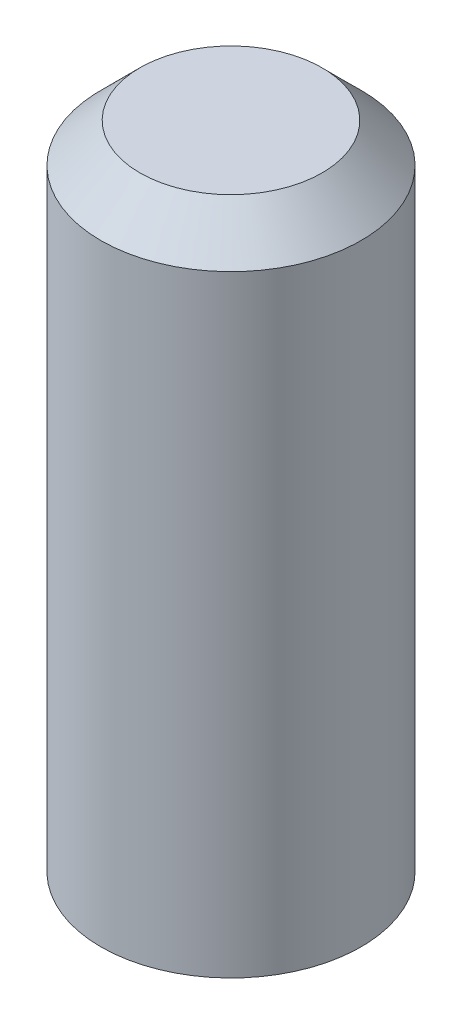
ISO-10303-21;
HEADER;
FILE_DESCRIPTION(('STEP AP214'),'2;1');
FILE_NAME('part.step','',(''),(''),'','','');
FILE_SCHEMA(('AUTOMOTIVE_DESIGN { 1 0 10303 214 1 1 1 1 }'));
ENDSEC;
DATA;
#1=APPLICATION_CONTEXT('core data for automotive mechanical design processes');
#2=APPLICATION_PROTOCOL_DEFINITION('international standard','automotive_design',2000,#1);
#3=PRODUCT_CONTEXT('',#1,'mechanical');
#4=PRODUCT('Part','Part','',(#3));
#5=PRODUCT_RELATED_PRODUCT_CATEGORY('part','',(#4));
#6=PRODUCT_DEFINITION_FORMATION('','',#4);
#7=PRODUCT_DEFINITION_CONTEXT('part definition',#1,'design');
#8=PRODUCT_DEFINITION('design','',#6,#7);
#9=PRODUCT_DEFINITION_SHAPE('','',#8);
#10=(LENGTH_UNIT() NAMED_UNIT(*) SI_UNIT(.MILLI.,.METRE.));
#11=(NAMED_UNIT(*) PLANE_ANGLE_UNIT() SI_UNIT($,.RADIAN.));
#12=(NAMED_UNIT(*) SI_UNIT($,.STERADIAN.) SOLID_ANGLE_UNIT());
#13=UNCERTAINTY_MEASURE_WITH_UNIT(LENGTH_MEASURE(1.E-05),#10,'distance_accuracy_value','');
#14=(GEOMETRIC_REPRESENTATION_CONTEXT(3) GLOBAL_UNCERTAINTY_ASSIGNED_CONTEXT((#13)) GLOBAL_UNIT_ASSIGNED_CONTEXT((#10,
#11,#12)) REPRESENTATION_CONTEXT('',''));
#15=CARTESIAN_POINT('',(0.,0.,0.));
#16=DIRECTION('',(0.,0.,1.));
#17=DIRECTION('',(1.,0.,0.));
#18=AXIS2_PLACEMENT_3D('',#15,#16,#17);
#19=CARTESIAN_POINT('',(0.,10.,0.));
#20=DIRECTION('',(0.,-1.,0.));
#21=DIRECTION('',(0.,0.,-1.));
#22=AXIS2_PLACEMENT_3D('',#19,#20,#21);
#23=CYLINDRICAL_SURFACE('',#22,2.);
#24=CARTESIAN_POINT('',(0.,9.4,0.));
#25=DIRECTION('',(0.,1.,0.));
#26=DIRECTION('',(0.,0.,1.));
#27=AXIS2_PLACEMENT_3D('',#24,#25,#26);
#28=CIRCLE('',#27,2.);
#29=CARTESIAN_POINT('',(0.,9.4,2.));
#30=VERTEX_POINT('',#29);
#31=EDGE_CURVE('E10',#30,#30,#28,.F.);
#32=ORIENTED_EDGE('',*,*,#31,.T.);
#33=EDGE_LOOP('',(#32));
#34=FACE_BOUND('',#33,.T.);
#35=CARTESIAN_POINT('',(0.,0.,0.));
#36=DIRECTION('',(0.,1.,0.));
#37=DIRECTION('',(0.,0.,1.));
#38=AXIS2_PLACEMENT_3D('',#35,#36,#37);
#39=CIRCLE('',#38,2.);
#40=CARTESIAN_POINT('',(0.,0.,2.));
#41=VERTEX_POINT('',#40);
#42=EDGE_CURVE('E42',#41,#41,#39,.T.);
#43=ORIENTED_EDGE('',*,*,#42,.T.);
#44=EDGE_LOOP('',(#43));
#45=FACE_BOUND('',#44,.T.);
#46=ADVANCED_FACE('F31',(#34,#45),#23,.T.);
#47=CARTESIAN_POINT('',(0.,10.,0.));
#48=DIRECTION('',(0.,1.,0.));
#49=DIRECTION('',(0.,0.,1.));
#50=AXIS2_PLACEMENT_3D('',#47,#48,#49);
#51=PLANE('',#50);
#52=CARTESIAN_POINT('',(0.,10.,0.));
#53=DIRECTION('',(0.,1.,0.));
#54=DIRECTION('',(0.,0.,1.));
#55=AXIS2_PLACEMENT_3D('',#52,#53,#54);
#56=CIRCLE('',#55,1.4);
#57=CARTESIAN_POINT('',(0.,10.,1.4));
#58=VERTEX_POINT('',#57);
#59=EDGE_CURVE('E38',#58,#58,#56,.T.);
#60=ORIENTED_EDGE('',*,*,#59,.T.);
#61=EDGE_LOOP('',(#60));
#62=FACE_BOUND('',#61,.T.);
#63=ADVANCED_FACE('F52',(#62),#51,.T.);
#64=CARTESIAN_POINT('',(0.,0.,0.));
#65=DIRECTION('',(0.,1.,0.));
#66=DIRECTION('',(0.,0.,1.));
#67=AXIS2_PLACEMENT_3D('',#64,#65,#66);
#68=PLANE('',#67);
#69=ORIENTED_EDGE('',*,*,#42,.F.);
#70=EDGE_LOOP('',(#69));
#71=FACE_BOUND('',#70,.T.);
#72=ADVANCED_FACE('F50',(#71),#68,.F.);
#73=CARTESIAN_POINT('',(0.,10.,0.));
#74=DIRECTION('',(0.,-1.,0.));
#75=DIRECTION('',(0.,0.,-1.));
#76=AXIS2_PLACEMENT_3D('',#73,#74,#75);
#77=CONICAL_SURFACE('',#76,1.4,0.785398163397447);
#78=ORIENTED_EDGE('',*,*,#31,.F.);
#79=EDGE_LOOP('',(#78));
#80=FACE_BOUND('',#79,.T.);
#81=ORIENTED_EDGE('',*,*,#59,.F.);
#82=EDGE_LOOP('',(#81));
#83=FACE_BOUND('',#82,.T.);
#84=ADVANCED_FACE('F33',(#80,#83),#77,.T.);
#85=CLOSED_SHELL('',(#46,#63,#72,#84));
#86=MANIFOLD_SOLID_BREP('B2',#85);
#87=ADVANCED_BREP_SHAPE_REPRESENTATION('',(#18,#86),#14);
#88=SHAPE_DEFINITION_REPRESENTATION(#9,#87);
ENDSEC;
END-ISO-10303-21;
